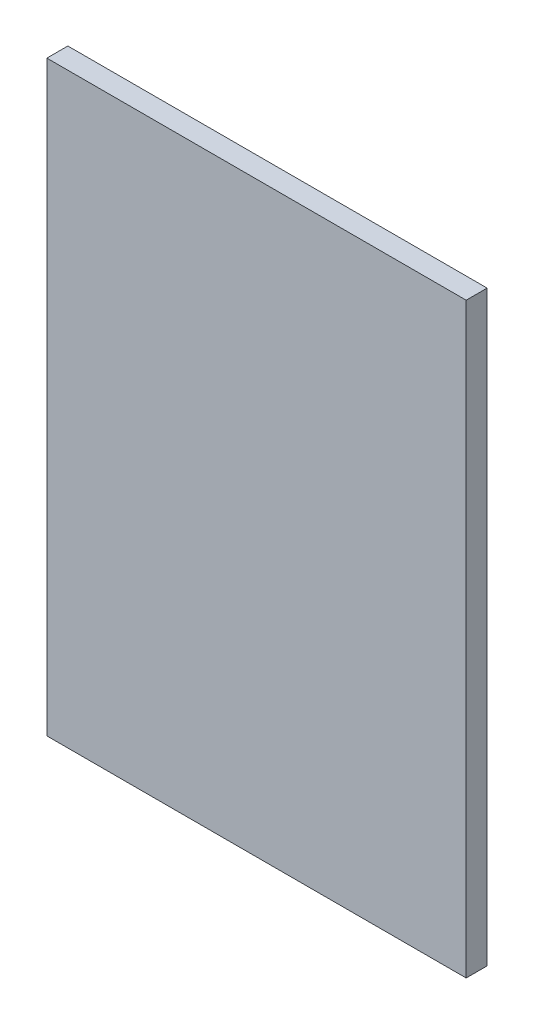
ISO-10303-21;
HEADER;
FILE_DESCRIPTION(('STEP AP214'),'2;1');
FILE_NAME('part.step','',(''),(''),'','','');
FILE_SCHEMA(('AUTOMOTIVE_DESIGN { 1 0 10303 214 1 1 1 1 }'));
ENDSEC;
DATA;
#1=APPLICATION_CONTEXT('core data for automotive mechanical design processes');
#2=APPLICATION_PROTOCOL_DEFINITION('international standard','automotive_design',2000,#1);
#3=PRODUCT_CONTEXT('',#1,'mechanical');
#4=PRODUCT('Part','Part','',(#3));
#5=PRODUCT_RELATED_PRODUCT_CATEGORY('part','',(#4));
#6=PRODUCT_DEFINITION_FORMATION('','',#4);
#7=PRODUCT_DEFINITION_CONTEXT('part definition',#1,'design');
#8=PRODUCT_DEFINITION('design','',#6,#7);
#9=PRODUCT_DEFINITION_SHAPE('','',#8);
#10=(LENGTH_UNIT() NAMED_UNIT(*) SI_UNIT(.MILLI.,.METRE.));
#11=(NAMED_UNIT(*) PLANE_ANGLE_UNIT() SI_UNIT($,.RADIAN.));
#12=(NAMED_UNIT(*) SI_UNIT($,.STERADIAN.) SOLID_ANGLE_UNIT());
#13=UNCERTAINTY_MEASURE_WITH_UNIT(LENGTH_MEASURE(1.E-05),#10,'distance_accuracy_value','');
#14=(GEOMETRIC_REPRESENTATION_CONTEXT(3) GLOBAL_UNCERTAINTY_ASSIGNED_CONTEXT((#13)) GLOBAL_UNIT_ASSIGNED_CONTEXT((#10,
#11,#12)) REPRESENTATION_CONTEXT('',''));
#15=CARTESIAN_POINT('',(0.,0.,0.));
#16=DIRECTION('',(0.,0.,1.));
#17=DIRECTION('',(1.,0.,0.));
#18=AXIS2_PLACEMENT_3D('',#15,#16,#17);
#19=CARTESIAN_POINT('',(25.,35.,2.5));
#20=DIRECTION('',(-1.,0.,0.));
#21=DIRECTION('',(0.,-1.,0.));
#22=AXIS2_PLACEMENT_3D('',#19,#20,#21);
#23=PLANE('',#22);
#24=DIRECTION('',(0.,1.,0.));
#25=VECTOR('',#24,1.);
#26=CARTESIAN_POINT('',(25.,35.,0.));
#27=LINE('',#26,#25);
#28=CARTESIAN_POINT('',(25.,-35.,0.));
#29=VERTEX_POINT('',#28);
#30=CARTESIAN_POINT('',(25.,35.,0.));
#31=VERTEX_POINT('',#30);
#32=EDGE_CURVE('E101',#29,#31,#27,.T.);
#33=ORIENTED_EDGE('',*,*,#32,.T.);
#34=DIRECTION('',(0.,0.,-1.));
#35=VECTOR('',#34,1.);
#36=CARTESIAN_POINT('',(25.,35.,2.5));
#37=LINE('',#36,#35);
#38=CARTESIAN_POINT('',(25.,35.,2.5));
#39=VERTEX_POINT('',#38);
#40=EDGE_CURVE('E11',#39,#31,#37,.T.);
#41=ORIENTED_EDGE('',*,*,#40,.F.);
#42=DIRECTION('',(0.,1.,0.));
#43=VECTOR('',#42,1.);
#44=CARTESIAN_POINT('',(25.,35.,2.5));
#45=LINE('',#44,#43);
#46=CARTESIAN_POINT('',(25.,-35.,2.5));
#47=VERTEX_POINT('',#46);
#48=EDGE_CURVE('E89',#47,#39,#45,.T.);
#49=ORIENTED_EDGE('',*,*,#48,.F.);
#50=DIRECTION('',(0.,0.,-1.));
#51=VECTOR('',#50,1.);
#52=CARTESIAN_POINT('',(25.,-35.,2.5));
#53=LINE('',#52,#51);
#54=EDGE_CURVE('E97',#47,#29,#53,.T.);
#55=ORIENTED_EDGE('',*,*,#54,.T.);
#56=EDGE_LOOP('',(#33,#41,#49,#55));
#57=FACE_BOUND('',#56,.T.);
#58=ADVANCED_FACE('F38',(#57),#23,.F.);
#59=CARTESIAN_POINT('',(-25.,35.,2.5));
#60=DIRECTION('',(0.,-1.,0.));
#61=DIRECTION('',(0.,0.,-1.));
#62=AXIS2_PLACEMENT_3D('',#59,#60,#61);
#63=PLANE('',#62);
#64=DIRECTION('',(-1.,0.,0.));
#65=VECTOR('',#64,1.);
#66=CARTESIAN_POINT('',(-25.,35.,0.));
#67=LINE('',#66,#65);
#68=CARTESIAN_POINT('',(-25.,35.,0.));
#69=VERTEX_POINT('',#68);
#70=EDGE_CURVE('E93',#31,#69,#67,.T.);
#71=ORIENTED_EDGE('',*,*,#70,.T.);
#72=DIRECTION('',(0.,0.,-1.));
#73=VECTOR('',#72,1.);
#74=CARTESIAN_POINT('',(-25.,35.,2.5));
#75=LINE('',#74,#73);
#76=CARTESIAN_POINT('',(-25.,35.,2.5));
#77=VERTEX_POINT('',#76);
#78=EDGE_CURVE('E46',#77,#69,#75,.T.);
#79=ORIENTED_EDGE('',*,*,#78,.F.);
#80=DIRECTION('',(-1.,0.,0.));
#81=VECTOR('',#80,1.);
#82=CARTESIAN_POINT('',(-25.,35.,2.5));
#83=LINE('',#82,#81);
#84=EDGE_CURVE('E84',#39,#77,#83,.T.);
#85=ORIENTED_EDGE('',*,*,#84,.F.);
#86=ORIENTED_EDGE('',*,*,#40,.T.);
#87=EDGE_LOOP('',(#71,#79,#85,#86));
#88=FACE_BOUND('',#87,.T.);
#89=ADVANCED_FACE('F92',(#88),#63,.F.);
#90=CARTESIAN_POINT('',(-25.,35.,2.5));
#91=DIRECTION('',(1.,0.,0.));
#92=DIRECTION('',(0.,1.,0.));
#93=AXIS2_PLACEMENT_3D('',#90,#91,#92);
#94=PLANE('',#93);
#95=DIRECTION('',(0.,-1.,0.));
#96=VECTOR('',#95,1.);
#97=CARTESIAN_POINT('',(-25.,35.,0.));
#98=LINE('',#97,#96);
#99=CARTESIAN_POINT('',(-25.,-35.,0.));
#100=VERTEX_POINT('',#99);
#101=EDGE_CURVE('E71',#69,#100,#98,.T.);
#102=ORIENTED_EDGE('',*,*,#101,.T.);
#103=DIRECTION('',(0.,0.,-1.));
#104=VECTOR('',#103,1.);
#105=CARTESIAN_POINT('',(-25.,-35.,2.5));
#106=LINE('',#105,#104);
#107=CARTESIAN_POINT('',(-25.,-35.,2.5));
#108=VERTEX_POINT('',#107);
#109=EDGE_CURVE('E94',#108,#100,#106,.T.);
#110=ORIENTED_EDGE('',*,*,#109,.F.);
#111=DIRECTION('',(0.,-1.,0.));
#112=VECTOR('',#111,1.);
#113=CARTESIAN_POINT('',(-25.,35.,2.5));
#114=LINE('',#113,#112);
#115=EDGE_CURVE('E87',#77,#108,#114,.T.);
#116=ORIENTED_EDGE('',*,*,#115,.F.);
#117=ORIENTED_EDGE('',*,*,#78,.T.);
#118=EDGE_LOOP('',(#102,#110,#116,#117));
#119=FACE_BOUND('',#118,.T.);
#120=ADVANCED_FACE('F95',(#119),#94,.F.);
#121=CARTESIAN_POINT('',(-25.,-35.,2.5));
#122=DIRECTION('',(0.,1.,0.));
#123=DIRECTION('',(0.,0.,1.));
#124=AXIS2_PLACEMENT_3D('',#121,#122,#123);
#125=PLANE('',#124);
#126=DIRECTION('',(1.,0.,0.));
#127=VECTOR('',#126,1.);
#128=CARTESIAN_POINT('',(-25.,-35.,0.));
#129=LINE('',#128,#127);
#130=EDGE_CURVE('E77',#100,#29,#129,.T.);
#131=ORIENTED_EDGE('',*,*,#130,.T.);
#132=ORIENTED_EDGE('',*,*,#54,.F.);
#133=DIRECTION('',(1.,0.,0.));
#134=VECTOR('',#133,1.);
#135=CARTESIAN_POINT('',(-25.,-35.,2.5));
#136=LINE('',#135,#134);
#137=EDGE_CURVE('E54',#108,#47,#136,.T.);
#138=ORIENTED_EDGE('',*,*,#137,.F.);
#139=ORIENTED_EDGE('',*,*,#109,.T.);
#140=EDGE_LOOP('',(#131,#132,#138,#139));
#141=FACE_BOUND('',#140,.T.);
#142=ADVANCED_FACE('F108',(#141),#125,.F.);
#143=CARTESIAN_POINT('',(0.,0.,2.5));
#144=DIRECTION('',(0.,0.,1.));
#145=DIRECTION('',(1.,0.,0.));
#146=AXIS2_PLACEMENT_3D('',#143,#144,#145);
#147=PLANE('',#146);
#148=ORIENTED_EDGE('',*,*,#48,.T.);
#149=ORIENTED_EDGE('',*,*,#84,.T.);
#150=ORIENTED_EDGE('',*,*,#115,.T.);
#151=ORIENTED_EDGE('',*,*,#137,.T.);
#152=EDGE_LOOP('',(#148,#149,#150,#151));
#153=FACE_BOUND('',#152,.T.);
#154=ADVANCED_FACE('F85',(#153),#147,.T.);
#155=CARTESIAN_POINT('',(0.,0.,0.));
#156=DIRECTION('',(0.,0.,1.));
#157=DIRECTION('',(1.,0.,0.));
#158=AXIS2_PLACEMENT_3D('',#155,#156,#157);
#159=PLANE('',#158);
#160=ORIENTED_EDGE('',*,*,#32,.F.);
#161=ORIENTED_EDGE('',*,*,#130,.F.);
#162=ORIENTED_EDGE('',*,*,#101,.F.);
#163=ORIENTED_EDGE('',*,*,#70,.F.);
#164=EDGE_LOOP('',(#160,#161,#162,#163));
#165=FACE_BOUND('',#164,.T.);
#166=ADVANCED_FACE('F111',(#165),#159,.F.);
#167=CLOSED_SHELL('',(#58,#89,#120,#142,#154,#166));
#168=MANIFOLD_SOLID_BREP('B2',#167);
#169=ADVANCED_BREP_SHAPE_REPRESENTATION('',(#18,#168),#14);
#170=SHAPE_DEFINITION_REPRESENTATION(#9,#169);
ENDSEC;
END-ISO-10303-21;
